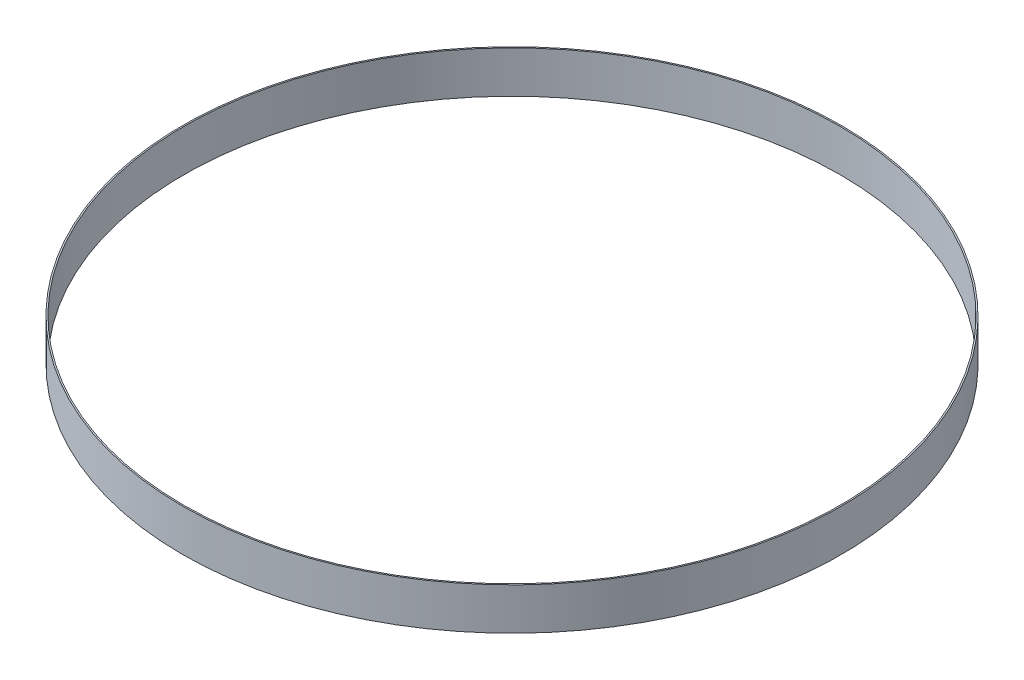
ISO-10303-21;
HEADER;
FILE_DESCRIPTION(('STEP AP214'),'2;1');
FILE_NAME('part.step','',(''),(''),'','','');
FILE_SCHEMA(('AUTOMOTIVE_DESIGN { 1 0 10303 214 1 1 1 1 }'));
ENDSEC;
DATA;
#1=APPLICATION_CONTEXT('core data for automotive mechanical design processes');
#2=APPLICATION_PROTOCOL_DEFINITION('international standard','automotive_design',2000,#1);
#3=PRODUCT_CONTEXT('',#1,'mechanical');
#4=PRODUCT('Part','Part','',(#3));
#5=PRODUCT_RELATED_PRODUCT_CATEGORY('part','',(#4));
#6=PRODUCT_DEFINITION_FORMATION('','',#4);
#7=PRODUCT_DEFINITION_CONTEXT('part definition',#1,'design');
#8=PRODUCT_DEFINITION('design','',#6,#7);
#9=PRODUCT_DEFINITION_SHAPE('','',#8);
#10=(LENGTH_UNIT() NAMED_UNIT(*) SI_UNIT(.MILLI.,.METRE.));
#11=(NAMED_UNIT(*) PLANE_ANGLE_UNIT() SI_UNIT($,.RADIAN.));
#12=(NAMED_UNIT(*) SI_UNIT($,.STERADIAN.) SOLID_ANGLE_UNIT());
#13=UNCERTAINTY_MEASURE_WITH_UNIT(LENGTH_MEASURE(1.E-05),#10,'distance_accuracy_value','');
#14=(GEOMETRIC_REPRESENTATION_CONTEXT(3) GLOBAL_UNCERTAINTY_ASSIGNED_CONTEXT((#13)) GLOBAL_UNIT_ASSIGNED_CONTEXT((#10,
#11,#12)) REPRESENTATION_CONTEXT('',''));
#15=CARTESIAN_POINT('',(0.,0.,0.));
#16=DIRECTION('',(0.,0.,1.));
#17=DIRECTION('',(1.,0.,0.));
#18=AXIS2_PLACEMENT_3D('',#15,#16,#17);
#19=CARTESIAN_POINT('',(0.,15.,0.));
#20=DIRECTION('',(0.,1.,0.));
#21=DIRECTION('',(0.,0.,1.));
#22=AXIS2_PLACEMENT_3D('',#19,#20,#21);
#23=PLANE('',#22);
#24=CARTESIAN_POINT('',(0.,15.,0.));
#25=DIRECTION('',(0.,1.,0.));
#26=DIRECTION('',(0.,0.,1.));
#27=AXIS2_PLACEMENT_3D('',#24,#25,#26);
#28=CIRCLE('',#27,236.);
#29=CARTESIAN_POINT('',(0.,15.,236.));
#30=VERTEX_POINT('',#29);
#31=EDGE_CURVE('E10',#30,#30,#28,.T.);
#32=ORIENTED_EDGE('',*,*,#31,.T.);
#33=EDGE_LOOP('',(#32));
#34=FACE_BOUND('',#33,.T.);
#35=CARTESIAN_POINT('',(0.,15.,0.));
#36=DIRECTION('',(0.,1.,0.));
#37=DIRECTION('',(0.,0.,1.));
#38=AXIS2_PLACEMENT_3D('',#35,#36,#37);
#39=CIRCLE('',#38,235.);
#40=CARTESIAN_POINT('',(0.,15.,235.));
#41=VERTEX_POINT('',#40);
#42=EDGE_CURVE('E50',#41,#41,#39,.T.);
#43=ORIENTED_EDGE('',*,*,#42,.F.);
#44=EDGE_LOOP('',(#43));
#45=FACE_BOUND('',#44,.T.);
#46=ADVANCED_FACE('F37',(#34,#45),#23,.T.);
#47=CARTESIAN_POINT('',(0.,-15.,0.));
#48=DIRECTION('',(0.,1.,0.));
#49=DIRECTION('',(0.,0.,1.));
#50=AXIS2_PLACEMENT_3D('',#47,#48,#49);
#51=PLANE('',#50);
#52=CARTESIAN_POINT('',(0.,-15.,0.));
#53=DIRECTION('',(0.,1.,0.));
#54=DIRECTION('',(0.,0.,1.));
#55=AXIS2_PLACEMENT_3D('',#52,#53,#54);
#56=CIRCLE('',#55,236.);
#57=CARTESIAN_POINT('',(0.,-15.,236.));
#58=VERTEX_POINT('',#57);
#59=EDGE_CURVE('E41',#58,#58,#56,.T.);
#60=ORIENTED_EDGE('',*,*,#59,.F.);
#61=EDGE_LOOP('',(#60));
#62=FACE_BOUND('',#61,.T.);
#63=CARTESIAN_POINT('',(0.,-15.,0.));
#64=DIRECTION('',(0.,1.,0.));
#65=DIRECTION('',(0.,0.,1.));
#66=AXIS2_PLACEMENT_3D('',#63,#64,#65);
#67=CIRCLE('',#66,235.);
#68=CARTESIAN_POINT('',(0.,-15.,235.));
#69=VERTEX_POINT('',#68);
#70=EDGE_CURVE('E52',#69,#69,#67,.T.);
#71=ORIENTED_EDGE('',*,*,#70,.T.);
#72=EDGE_LOOP('',(#71));
#73=FACE_BOUND('',#72,.T.);
#74=ADVANCED_FACE('F64',(#62,#73),#51,.F.);
#75=CARTESIAN_POINT('',(0.,15.,0.));
#76=DIRECTION('',(0.,-1.,0.));
#77=DIRECTION('',(0.,0.,-1.));
#78=AXIS2_PLACEMENT_3D('',#75,#76,#77);
#79=CYLINDRICAL_SURFACE('',#78,236.);
#80=ORIENTED_EDGE('',*,*,#31,.F.);
#81=EDGE_LOOP('',(#80));
#82=FACE_BOUND('',#81,.T.);
#83=ORIENTED_EDGE('',*,*,#59,.T.);
#84=EDGE_LOOP('',(#83));
#85=FACE_BOUND('',#84,.T.);
#86=ADVANCED_FACE('F39',(#82,#85),#79,.T.);
#87=CARTESIAN_POINT('',(0.,15.,0.));
#88=DIRECTION('',(0.,-1.,0.));
#89=DIRECTION('',(0.,0.,-1.));
#90=AXIS2_PLACEMENT_3D('',#87,#88,#89);
#91=CYLINDRICAL_SURFACE('',#90,235.);
#92=ORIENTED_EDGE('',*,*,#42,.T.);
#93=EDGE_LOOP('',(#92));
#94=FACE_BOUND('',#93,.T.);
#95=ORIENTED_EDGE('',*,*,#70,.F.);
#96=EDGE_LOOP('',(#95));
#97=FACE_BOUND('',#96,.T.);
#98=ADVANCED_FACE('F60',(#94,#97),#91,.F.);
#99=CLOSED_SHELL('',(#46,#74,#86,#98));
#100=MANIFOLD_SOLID_BREP('B2',#99);
#101=ADVANCED_BREP_SHAPE_REPRESENTATION('',(#18,#100),#14);
#102=SHAPE_DEFINITION_REPRESENTATION(#9,#101);
ENDSEC;
END-ISO-10303-21;
